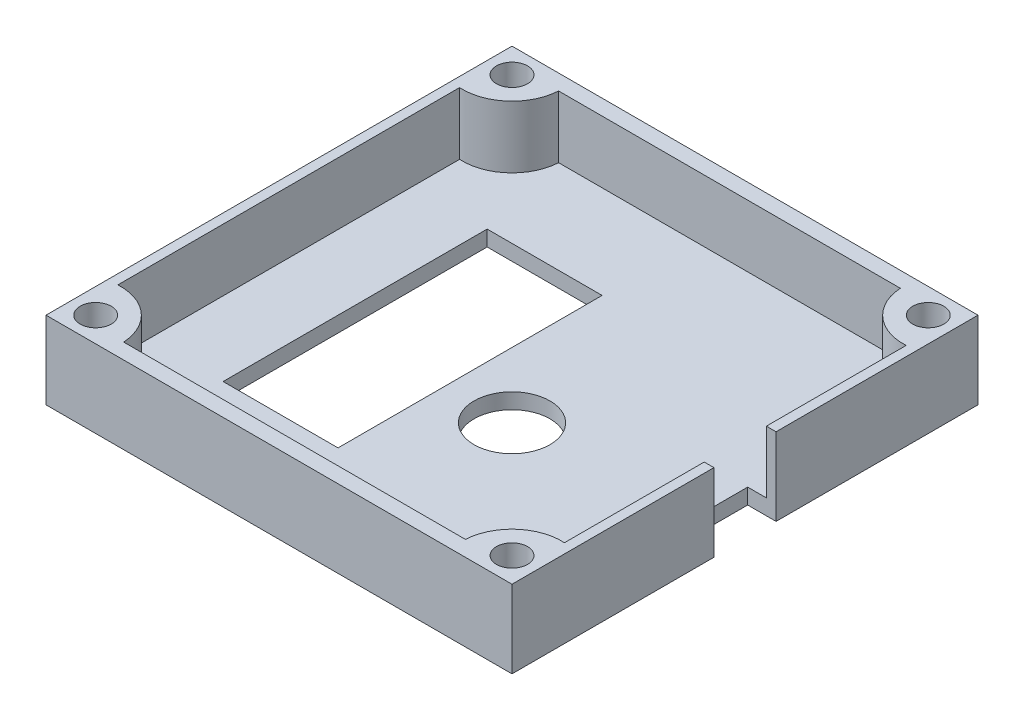
ISO-10303-21;
HEADER;
FILE_DESCRIPTION(('STEP AP214'),'2;1');
FILE_NAME('part.step','',(''),(''),'','','');
FILE_SCHEMA(('AUTOMOTIVE_DESIGN { 1 0 10303 214 1 1 1 1 }'));
ENDSEC;
DATA;
#1=APPLICATION_CONTEXT('core data for automotive mechanical design processes');
#2=APPLICATION_PROTOCOL_DEFINITION('international standard','automotive_design',2000,#1);
#3=PRODUCT_CONTEXT('',#1,'mechanical');
#4=PRODUCT('Part','Part','',(#3));
#5=PRODUCT_RELATED_PRODUCT_CATEGORY('part','',(#4));
#6=PRODUCT_DEFINITION_FORMATION('','',#4);
#7=PRODUCT_DEFINITION_CONTEXT('part definition',#1,'design');
#8=PRODUCT_DEFINITION('design','',#6,#7);
#9=PRODUCT_DEFINITION_SHAPE('','',#8);
#10=(LENGTH_UNIT() NAMED_UNIT(*) SI_UNIT(.MILLI.,.METRE.));
#11=(NAMED_UNIT(*) PLANE_ANGLE_UNIT() SI_UNIT($,.RADIAN.));
#12=(NAMED_UNIT(*) SI_UNIT($,.STERADIAN.) SOLID_ANGLE_UNIT());
#13=UNCERTAINTY_MEASURE_WITH_UNIT(LENGTH_MEASURE(1.E-05),#10,'distance_accuracy_value','');
#14=(GEOMETRIC_REPRESENTATION_CONTEXT(3) GLOBAL_UNCERTAINTY_ASSIGNED_CONTEXT((#13)) GLOBAL_UNIT_ASSIGNED_CONTEXT((#10,
#11,#12)) REPRESENTATION_CONTEXT('',''));
#15=CARTESIAN_POINT('',(0.,0.,0.));
#16=DIRECTION('',(0.,0.,1.));
#17=DIRECTION('',(1.,0.,0.));
#18=AXIS2_PLACEMENT_3D('',#15,#16,#17);
#19=CARTESIAN_POINT('',(0.,6.35,0.));
#20=DIRECTION('',(0.,1.,0.));
#21=DIRECTION('',(0.,0.,1.));
#22=AXIS2_PLACEMENT_3D('',#19,#20,#21);
#23=PLANE('',#22);
#24=CARTESIAN_POINT('',(17.018,6.35,17.018));
#25=DIRECTION('',(0.,1.,0.));
#26=DIRECTION('',(0.,0.,1.));
#27=AXIS2_PLACEMENT_3D('',#24,#25,#26);
#28=CIRCLE('',#27,1.27);
#29=CARTESIAN_POINT('',(17.018,6.35,18.288));
#30=VERTEX_POINT('',#29);
#31=EDGE_CURVE('E321',#30,#30,#28,.T.);
#32=ORIENTED_EDGE('',*,*,#31,.F.);
#33=EDGE_LOOP('',(#32));
#34=FACE_BOUND('',#33,.T.);
#35=CARTESIAN_POINT('',(-17.018,6.35,-17.018));
#36=DIRECTION('',(0.,1.,0.));
#37=DIRECTION('',(0.,0.,1.));
#38=AXIS2_PLACEMENT_3D('',#35,#36,#37);
#39=CIRCLE('',#38,1.27);
#40=CARTESIAN_POINT('',(-17.018,6.35,-15.748));
#41=VERTEX_POINT('',#40);
#42=EDGE_CURVE('E333',#41,#41,#39,.T.);
#43=ORIENTED_EDGE('',*,*,#42,.F.);
#44=EDGE_LOOP('',(#43));
#45=FACE_BOUND('',#44,.T.);
#46=CARTESIAN_POINT('',(-17.018,6.35,17.018));
#47=DIRECTION('',(0.,1.,0.));
#48=DIRECTION('',(0.,0.,-1.));
#49=AXIS2_PLACEMENT_3D('',#46,#47,#48);
#50=CIRCLE('',#49,1.27);
#51=CARTESIAN_POINT('',(-17.018,6.35,15.748));
#52=VERTEX_POINT('',#51);
#53=EDGE_CURVE('E327',#52,#52,#50,.T.);
#54=ORIENTED_EDGE('',*,*,#53,.F.);
#55=EDGE_LOOP('',(#54));
#56=FACE_BOUND('',#55,.T.);
#57=CARTESIAN_POINT('',(17.018,6.35,-17.018));
#58=DIRECTION('',(0.,1.,0.));
#59=DIRECTION('',(0.,0.,-1.));
#60=AXIS2_PLACEMENT_3D('',#57,#58,#59);
#61=CIRCLE('',#60,1.27);
#62=CARTESIAN_POINT('',(17.018,6.35,-18.288));
#63=VERTEX_POINT('',#62);
#64=EDGE_CURVE('E315',#63,#63,#61,.T.);
#65=ORIENTED_EDGE('',*,*,#64,.F.);
#66=EDGE_LOOP('',(#65));
#67=FACE_BOUND('',#66,.T.);
#68=DIRECTION('',(0.,0.,1.));
#69=VECTOR('',#68,1.);
#70=CARTESIAN_POINT('',(18.2562620388484,6.35,0.));
#71=LINE('',#70,#69);
#72=CARTESIAN_POINT('',(18.2562620388484,6.35,-13.97));
#73=VERTEX_POINT('',#72);
#74=CARTESIAN_POINT('',(18.2562620388484,6.35,-2.54000000000001));
#75=VERTEX_POINT('',#74);
#76=EDGE_CURVE('E273',#73,#75,#71,.T.);
#77=ORIENTED_EDGE('',*,*,#76,.T.);
#78=DIRECTION('',(-1.,0.,0.));
#79=VECTOR('',#78,1.);
#80=CARTESIAN_POINT('',(0.,6.35,-2.54000000000001));
#81=LINE('',#80,#79);
#82=CARTESIAN_POINT('',(19.05,6.35,-2.54000000000001));
#83=VERTEX_POINT('',#82);
#84=EDGE_CURVE('E191',#83,#75,#81,.T.);
#85=ORIENTED_EDGE('',*,*,#84,.F.);
#86=DIRECTION('',(0.,0.,-1.));
#87=VECTOR('',#86,1.);
#88=CARTESIAN_POINT('',(19.05,6.35,19.05));
#89=LINE('',#88,#87);
#90=CARTESIAN_POINT('',(19.05,6.35,-19.05));
#91=VERTEX_POINT('',#90);
#92=EDGE_CURVE('E345',#83,#91,#89,.T.);
#93=ORIENTED_EDGE('',*,*,#92,.T.);
#94=DIRECTION('',(-1.,0.,0.));
#95=VECTOR('',#94,1.);
#96=CARTESIAN_POINT('',(19.05,6.35,-19.05));
#97=LINE('',#96,#95);
#98=CARTESIAN_POINT('',(-19.05,6.35,-19.05));
#99=VERTEX_POINT('',#98);
#100=EDGE_CURVE('E349',#91,#99,#97,.T.);
#101=ORIENTED_EDGE('',*,*,#100,.T.);
#102=DIRECTION('',(0.,0.,1.));
#103=VECTOR('',#102,1.);
#104=CARTESIAN_POINT('',(-19.05,6.35,19.05));
#105=LINE('',#104,#103);
#106=CARTESIAN_POINT('',(-19.05,6.35,19.05));
#107=VERTEX_POINT('',#106);
#108=EDGE_CURVE('E339',#99,#107,#105,.T.);
#109=ORIENTED_EDGE('',*,*,#108,.T.);
#110=DIRECTION('',(1.,0.,0.));
#111=VECTOR('',#110,1.);
#112=CARTESIAN_POINT('',(19.05,6.35,19.05));
#113=LINE('',#112,#111);
#114=CARTESIAN_POINT('',(19.05,6.35,19.05));
#115=VERTEX_POINT('',#114);
#116=EDGE_CURVE('E342',#107,#115,#113,.T.);
#117=ORIENTED_EDGE('',*,*,#116,.T.);
#118=CARTESIAN_POINT('',(19.05,6.35,2.54000000000001));
#119=VERTEX_POINT('',#118);
#120=EDGE_CURVE('E346',#115,#119,#89,.T.);
#121=ORIENTED_EDGE('',*,*,#120,.T.);
#122=DIRECTION('',(-1.,0.,0.));
#123=VECTOR('',#122,1.);
#124=CARTESIAN_POINT('',(0.,6.35,2.54000000000001));
#125=LINE('',#124,#123);
#126=CARTESIAN_POINT('',(18.2562620388484,6.35,2.54000000000001));
#127=VERTEX_POINT('',#126);
#128=EDGE_CURVE('E206',#119,#127,#125,.T.);
#129=ORIENTED_EDGE('',*,*,#128,.T.);
#130=CARTESIAN_POINT('',(18.2562620388484,6.35,13.97));
#131=VERTEX_POINT('',#130);
#132=EDGE_CURVE('E249',#127,#131,#71,.T.);
#133=ORIENTED_EDGE('',*,*,#132,.T.);
#134=CARTESIAN_POINT('',(18.0181310194242,6.35,18.0181310194242));
#135=DIRECTION('',(0.,1.,0.));
#136=DIRECTION('',(0.,0.,1.));
#137=AXIS2_PLACEMENT_3D('',#134,#135,#136);
#138=CIRCLE('',#137,4.05512899089987);
#139=CARTESIAN_POINT('',(13.97,6.35,17.78));
#140=VERTEX_POINT('',#139);
#141=EDGE_CURVE('E294',#131,#140,#138,.T.);
#142=ORIENTED_EDGE('',*,*,#141,.T.);
#143=DIRECTION('',(1.,0.,0.));
#144=VECTOR('',#143,1.);
#145=CARTESIAN_POINT('',(0.,6.35,17.78));
#146=LINE('',#145,#144);
#147=CARTESIAN_POINT('',(-13.97,6.35,17.78));
#148=VERTEX_POINT('',#147);
#149=EDGE_CURVE('E291',#148,#140,#146,.T.);
#150=ORIENTED_EDGE('',*,*,#149,.F.);
#151=CARTESIAN_POINT('',(-18.0181310194242,6.35,18.0181310194242));
#152=DIRECTION('',(0.,1.,0.));
#153=DIRECTION('',(0.,0.,1.));
#154=AXIS2_PLACEMENT_3D('',#151,#152,#153);
#155=CIRCLE('',#154,4.05512899089987);
#156=CARTESIAN_POINT('',(-18.2562620388484,6.35,13.97));
#157=VERTEX_POINT('',#156);
#158=EDGE_CURVE('E288',#157,#148,#155,.F.);
#159=ORIENTED_EDGE('',*,*,#158,.F.);
#160=DIRECTION('',(0.,0.,1.));
#161=VECTOR('',#160,1.);
#162=CARTESIAN_POINT('',(-18.2562620388484,6.35,0.));
#163=LINE('',#162,#161);
#164=CARTESIAN_POINT('',(-18.2562620388484,6.35,-13.97));
#165=VERTEX_POINT('',#164);
#166=EDGE_CURVE('E285',#165,#157,#163,.T.);
#167=ORIENTED_EDGE('',*,*,#166,.F.);
#168=CARTESIAN_POINT('',(-18.0181310194242,6.35,-18.0181310194242));
#169=DIRECTION('',(0.,1.,0.));
#170=DIRECTION('',(0.,0.,1.));
#171=AXIS2_PLACEMENT_3D('',#168,#169,#170);
#172=CIRCLE('',#171,4.05512899089987);
#173=CARTESIAN_POINT('',(-13.97,6.35,-17.78));
#174=VERTEX_POINT('',#173);
#175=EDGE_CURVE('E282',#165,#174,#172,.T.);
#176=ORIENTED_EDGE('',*,*,#175,.T.);
#177=DIRECTION('',(1.,0.,0.));
#178=VECTOR('',#177,1.);
#179=CARTESIAN_POINT('',(0.,6.35,-17.78));
#180=LINE('',#179,#178);
#181=CARTESIAN_POINT('',(13.97,6.35,-17.78));
#182=VERTEX_POINT('',#181);
#183=EDGE_CURVE('E279',#174,#182,#180,.T.);
#184=ORIENTED_EDGE('',*,*,#183,.T.);
#185=CARTESIAN_POINT('',(18.0181310194242,6.35,-18.0181310194242));
#186=DIRECTION('',(0.,1.,0.));
#187=DIRECTION('',(0.,0.,1.));
#188=AXIS2_PLACEMENT_3D('',#185,#186,#187);
#189=CIRCLE('',#188,4.05512899089987);
#190=EDGE_CURVE('E276',#73,#182,#189,.F.);
#191=ORIENTED_EDGE('',*,*,#190,.F.);
#192=EDGE_LOOP('',(#77,#85,#93,#101,#109,#117,#121,#129,#133,#142,#150,#159,#167,#176,#184,#191));
#193=FACE_BOUND('',#192,.T.);
#194=ADVANCED_FACE('F33',(#34,#45,#56,#67,#193),#23,.T.);
#195=CARTESIAN_POINT('',(0.,0.,0.));
#196=DIRECTION('',(0.,1.,0.));
#197=DIRECTION('',(0.,0.,1.));
#198=AXIS2_PLACEMENT_3D('',#195,#196,#197);
#199=PLANE('',#198);
#200=CARTESIAN_POINT('',(2.54,0.,2.54000000000001));
#201=DIRECTION('',(0.,-1.,0.));
#202=DIRECTION('',(0.,0.,-1.));
#203=AXIS2_PLACEMENT_3D('',#200,#201,#202);
#204=CIRCLE('',#203,3.1018943278166);
#205=CARTESIAN_POINT('',(2.54,0.,-0.561894327816595));
#206=VERTEX_POINT('',#205);
#207=EDGE_CURVE('E525',#206,#206,#204,.T.);
#208=ORIENTED_EDGE('',*,*,#207,.F.);
#209=EDGE_LOOP('',(#208));
#210=FACE_BOUND('',#209,.T.);
#211=CARTESIAN_POINT('',(17.018,0.,-17.018));
#212=DIRECTION('',(0.,1.,0.));
#213=DIRECTION('',(0.,0.,-1.));
#214=AXIS2_PLACEMENT_3D('',#211,#212,#213);
#215=CIRCLE('',#214,1.27);
#216=CARTESIAN_POINT('',(17.018,0.,-18.288));
#217=VERTEX_POINT('',#216);
#218=EDGE_CURVE('E300',#217,#217,#215,.T.);
#219=ORIENTED_EDGE('',*,*,#218,.T.);
#220=EDGE_LOOP('',(#219));
#221=FACE_BOUND('',#220,.T.);
#222=CARTESIAN_POINT('',(17.018,0.,17.018));
#223=DIRECTION('',(0.,1.,0.));
#224=DIRECTION('',(0.,0.,1.));
#225=AXIS2_PLACEMENT_3D('',#222,#223,#224);
#226=CIRCLE('',#225,1.27);
#227=CARTESIAN_POINT('',(17.018,0.,18.288));
#228=VERTEX_POINT('',#227);
#229=EDGE_CURVE('E318',#228,#228,#226,.T.);
#230=ORIENTED_EDGE('',*,*,#229,.T.);
#231=EDGE_LOOP('',(#230));
#232=FACE_BOUND('',#231,.T.);
#233=CARTESIAN_POINT('',(-17.018,0.,17.018));
#234=DIRECTION('',(0.,1.,0.));
#235=DIRECTION('',(0.,0.,-1.));
#236=AXIS2_PLACEMENT_3D('',#233,#234,#235);
#237=CIRCLE('',#236,1.27);
#238=CARTESIAN_POINT('',(-17.018,0.,15.748));
#239=VERTEX_POINT('',#238);
#240=EDGE_CURVE('E324',#239,#239,#237,.T.);
#241=ORIENTED_EDGE('',*,*,#240,.T.);
#242=EDGE_LOOP('',(#241));
#243=FACE_BOUND('',#242,.T.);
#244=CARTESIAN_POINT('',(-17.018,0.,-17.018));
#245=DIRECTION('',(0.,1.,0.));
#246=DIRECTION('',(0.,0.,1.));
#247=AXIS2_PLACEMENT_3D('',#244,#245,#246);
#248=CIRCLE('',#247,1.27);
#249=CARTESIAN_POINT('',(-17.018,0.,-15.748));
#250=VERTEX_POINT('',#249);
#251=EDGE_CURVE('E330',#250,#250,#248,.T.);
#252=ORIENTED_EDGE('',*,*,#251,.T.);
#253=EDGE_LOOP('',(#252));
#254=FACE_BOUND('',#253,.T.);
#255=DIRECTION('',(1.,0.,0.));
#256=VECTOR('',#255,1.);
#257=CARTESIAN_POINT('',(-2.794,0.,-10.16));
#258=LINE('',#257,#256);
#259=CARTESIAN_POINT('',(-12.192,0.,-10.16));
#260=VERTEX_POINT('',#259);
#261=CARTESIAN_POINT('',(-2.794,0.,-10.16));
#262=VERTEX_POINT('',#261);
#263=EDGE_CURVE('E229',#260,#262,#258,.T.);
#264=ORIENTED_EDGE('',*,*,#263,.F.);
#265=DIRECTION('',(0.,0.,-1.));
#266=VECTOR('',#265,1.);
#267=CARTESIAN_POINT('',(-12.192,0.,-10.16));
#268=LINE('',#267,#266);
#269=CARTESIAN_POINT('',(-12.192,0.,11.43));
#270=VERTEX_POINT('',#269);
#271=EDGE_CURVE('E57',#270,#260,#268,.T.);
#272=ORIENTED_EDGE('',*,*,#271,.F.);
#273=DIRECTION('',(-1.,0.,0.));
#274=VECTOR('',#273,1.);
#275=CARTESIAN_POINT('',(-2.794,0.,11.43));
#276=LINE('',#275,#274);
#277=CARTESIAN_POINT('',(-2.794,0.,11.43));
#278=VERTEX_POINT('',#277);
#279=EDGE_CURVE('E235',#278,#270,#276,.T.);
#280=ORIENTED_EDGE('',*,*,#279,.F.);
#281=DIRECTION('',(0.,0.,1.));
#282=VECTOR('',#281,1.);
#283=CARTESIAN_POINT('',(-2.794,0.,-10.16));
#284=LINE('',#283,#282);
#285=EDGE_CURVE('E232',#262,#278,#284,.T.);
#286=ORIENTED_EDGE('',*,*,#285,.F.);
#287=EDGE_LOOP('',(#264,#272,#280,#286));
#288=FACE_BOUND('',#287,.T.);
#289=DIRECTION('',(-1.,0.,0.));
#290=VECTOR('',#289,1.);
#291=CARTESIAN_POINT('',(0.,0.,-2.54000000000001));
#292=LINE('',#291,#290);
#293=CARTESIAN_POINT('',(19.05,0.,-2.54000000000001));
#294=VERTEX_POINT('',#293);
#295=CARTESIAN_POINT('',(16.7295982245568,0.,-2.54000000000001));
#296=VERTEX_POINT('',#295);
#297=EDGE_CURVE('E204',#294,#296,#292,.T.);
#298=ORIENTED_EDGE('',*,*,#297,.T.);
#299=DIRECTION('',(0.,0.,1.));
#300=VECTOR('',#299,1.);
#301=CARTESIAN_POINT('',(16.7295982245568,0.,0.));
#302=LINE('',#301,#300);
#303=CARTESIAN_POINT('',(16.7295982245568,0.,2.54000000000001));
#304=VERTEX_POINT('',#303);
#305=EDGE_CURVE('E186',#296,#304,#302,.T.);
#306=ORIENTED_EDGE('',*,*,#305,.T.);
#307=DIRECTION('',(-1.,0.,0.));
#308=VECTOR('',#307,1.);
#309=CARTESIAN_POINT('',(0.,0.,2.54000000000001));
#310=LINE('',#309,#308);
#311=CARTESIAN_POINT('',(19.05,0.,2.54000000000001));
#312=VERTEX_POINT('',#311);
#313=EDGE_CURVE('E194',#312,#304,#310,.T.);
#314=ORIENTED_EDGE('',*,*,#313,.F.);
#315=DIRECTION('',(0.,0.,-1.));
#316=VECTOR('',#315,1.);
#317=CARTESIAN_POINT('',(19.05,0.,19.05));
#318=LINE('',#317,#316);
#319=CARTESIAN_POINT('',(19.05,0.,19.05));
#320=VERTEX_POINT('',#319);
#321=EDGE_CURVE('E357',#320,#312,#318,.T.);
#322=ORIENTED_EDGE('',*,*,#321,.F.);
#323=DIRECTION('',(1.,0.,0.));
#324=VECTOR('',#323,1.);
#325=CARTESIAN_POINT('',(19.05,0.,19.05));
#326=LINE('',#325,#324);
#327=CARTESIAN_POINT('',(-19.05,0.,19.05));
#328=VERTEX_POINT('',#327);
#329=EDGE_CURVE('E354',#328,#320,#326,.T.);
#330=ORIENTED_EDGE('',*,*,#329,.F.);
#331=DIRECTION('',(0.,0.,1.));
#332=VECTOR('',#331,1.);
#333=CARTESIAN_POINT('',(-19.05,0.,19.05));
#334=LINE('',#333,#332);
#335=CARTESIAN_POINT('',(-19.05,0.,-19.05));
#336=VERTEX_POINT('',#335);
#337=EDGE_CURVE('E336',#336,#328,#334,.T.);
#338=ORIENTED_EDGE('',*,*,#337,.F.);
#339=DIRECTION('',(-1.,0.,0.));
#340=VECTOR('',#339,1.);
#341=CARTESIAN_POINT('',(19.05,0.,-19.05));
#342=LINE('',#341,#340);
#343=CARTESIAN_POINT('',(19.05,0.,-19.05));
#344=VERTEX_POINT('',#343);
#345=EDGE_CURVE('E343',#344,#336,#342,.T.);
#346=ORIENTED_EDGE('',*,*,#345,.F.);
#347=EDGE_CURVE('E356',#294,#344,#318,.T.);
#348=ORIENTED_EDGE('',*,*,#347,.F.);
#349=EDGE_LOOP('',(#298,#306,#314,#322,#330,#338,#346,#348));
#350=FACE_BOUND('',#349,.T.);
#351=ADVANCED_FACE('F202',(#210,#221,#232,#243,#254,#288,#350),#199,.F.);
#352=CARTESIAN_POINT('',(19.05,6.35,19.05));
#353=DIRECTION('',(-1.,0.,0.));
#354=DIRECTION('',(0.,0.,1.));
#355=AXIS2_PLACEMENT_3D('',#352,#353,#354);
#356=PLANE('',#355);
#357=DIRECTION('',(0.,1.,0.));
#358=VECTOR('',#357,1.);
#359=CARTESIAN_POINT('',(19.05,6.35,-2.54000000000001));
#360=LINE('',#359,#358);
#361=EDGE_CURVE('E217',#294,#83,#360,.T.);
#362=ORIENTED_EDGE('',*,*,#361,.F.);
#363=ORIENTED_EDGE('',*,*,#347,.T.);
#364=DIRECTION('',(0.,-1.,0.));
#365=VECTOR('',#364,1.);
#366=CARTESIAN_POINT('',(19.05,6.35,-19.05));
#367=LINE('',#366,#365);
#368=EDGE_CURVE('E362',#91,#344,#367,.T.);
#369=ORIENTED_EDGE('',*,*,#368,.F.);
#370=ORIENTED_EDGE('',*,*,#92,.F.);
#371=EDGE_LOOP('',(#362,#363,#369,#370));
#372=FACE_BOUND('',#371,.T.);
#373=ADVANCED_FACE('F423',(#372),#356,.F.);
#374=CARTESIAN_POINT('',(18.2562620388484,1.27,0.));
#375=DIRECTION('',(-1.,0.,0.));
#376=DIRECTION('',(0.,0.,1.));
#377=AXIS2_PLACEMENT_3D('',#374,#375,#376);
#378=PLANE('',#377);
#379=DIRECTION('',(0.,0.,1.));
#380=VECTOR('',#379,1.);
#381=CARTESIAN_POINT('',(18.2562620388484,1.27,0.));
#382=LINE('',#381,#380);
#383=CARTESIAN_POINT('',(18.2562620388484,1.27,-13.97));
#384=VERTEX_POINT('',#383);
#385=CARTESIAN_POINT('',(18.2562620388484,1.27,-2.54000000000001));
#386=VERTEX_POINT('',#385);
#387=EDGE_CURVE('E250',#384,#386,#382,.T.);
#388=ORIENTED_EDGE('',*,*,#387,.T.);
#389=DIRECTION('',(0.,1.,0.));
#390=VECTOR('',#389,1.);
#391=CARTESIAN_POINT('',(18.2562620388484,1.27,-2.54000000000001));
#392=LINE('',#391,#390);
#393=EDGE_CURVE('E214',#386,#75,#392,.T.);
#394=ORIENTED_EDGE('',*,*,#393,.T.);
#395=ORIENTED_EDGE('',*,*,#76,.F.);
#396=DIRECTION('',(0.,1.,0.));
#397=VECTOR('',#396,1.);
#398=CARTESIAN_POINT('',(18.2562620388484,1.27,-13.97));
#399=LINE('',#398,#397);
#400=EDGE_CURVE('E272',#384,#73,#399,.T.);
#401=ORIENTED_EDGE('',*,*,#400,.F.);
#402=EDGE_LOOP('',(#388,#394,#395,#401));
#403=FACE_BOUND('',#402,.T.);
#404=ADVANCED_FACE('F416',(#403),#378,.T.);
#405=CARTESIAN_POINT('',(0.,1.27,0.));
#406=DIRECTION('',(0.,1.,0.));
#407=DIRECTION('',(0.,0.,1.));
#408=AXIS2_PLACEMENT_3D('',#405,#406,#407);
#409=PLANE('',#408);
#410=CARTESIAN_POINT('',(2.54,1.27,2.54000000000001));
#411=DIRECTION('',(0.,1.,0.));
#412=DIRECTION('',(0.,0.,1.));
#413=AXIS2_PLACEMENT_3D('',#410,#411,#412);
#414=CIRCLE('',#413,3.1018943278166);
#415=CARTESIAN_POINT('',(2.54,1.27,5.64189432781661));
#416=VERTEX_POINT('',#415);
#417=EDGE_CURVE('E37',#416,#416,#414,.T.);
#418=ORIENTED_EDGE('',*,*,#417,.F.);
#419=EDGE_LOOP('',(#418));
#420=FACE_BOUND('',#419,.T.);
#421=DIRECTION('',(0.,0.,-1.));
#422=VECTOR('',#421,1.);
#423=CARTESIAN_POINT('',(-12.192,1.27,-10.16));
#424=LINE('',#423,#422);
#425=CARTESIAN_POINT('',(-12.192,1.27,11.43));
#426=VERTEX_POINT('',#425);
#427=CARTESIAN_POINT('',(-12.192,1.27,-10.16));
#428=VERTEX_POINT('',#427);
#429=EDGE_CURVE('E225',#426,#428,#424,.T.);
#430=ORIENTED_EDGE('',*,*,#429,.T.);
#431=DIRECTION('',(1.,0.,0.));
#432=VECTOR('',#431,1.);
#433=CARTESIAN_POINT('',(-2.794,1.27,-10.16));
#434=LINE('',#433,#432);
#435=CARTESIAN_POINT('',(-2.794,1.27,-10.16));
#436=VERTEX_POINT('',#435);
#437=EDGE_CURVE('E241',#428,#436,#434,.T.);
#438=ORIENTED_EDGE('',*,*,#437,.T.);
#439=DIRECTION('',(0.,0.,1.));
#440=VECTOR('',#439,1.);
#441=CARTESIAN_POINT('',(-2.794,1.27,-10.16));
#442=LINE('',#441,#440);
#443=CARTESIAN_POINT('',(-2.794,1.27,11.43));
#444=VERTEX_POINT('',#443);
#445=EDGE_CURVE('E219',#436,#444,#442,.T.);
#446=ORIENTED_EDGE('',*,*,#445,.T.);
#447=DIRECTION('',(-1.,0.,0.));
#448=VECTOR('',#447,1.);
#449=CARTESIAN_POINT('',(-2.794,1.27,11.43));
#450=LINE('',#449,#448);
#451=EDGE_CURVE('E222',#444,#426,#450,.T.);
#452=ORIENTED_EDGE('',*,*,#451,.T.);
#453=EDGE_LOOP('',(#430,#438,#446,#452));
#454=FACE_BOUND('',#453,.T.);
#455=DIRECTION('',(0.,0.,-1.));
#456=VECTOR('',#455,1.);
#457=CARTESIAN_POINT('',(16.7295982245568,1.27,0.));
#458=LINE('',#457,#456);
#459=CARTESIAN_POINT('',(16.7295982245568,1.27,2.54000000000001));
#460=VERTEX_POINT('',#459);
#461=CARTESIAN_POINT('',(16.7295982245568,1.27,-2.54000000000001));
#462=VERTEX_POINT('',#461);
#463=EDGE_CURVE('E42',#460,#462,#458,.T.);
#464=ORIENTED_EDGE('',*,*,#463,.T.);
#465=DIRECTION('',(1.,0.,0.));
#466=VECTOR('',#465,1.);
#467=CARTESIAN_POINT('',(0.,1.27,-2.54000000000001));
#468=LINE('',#467,#466);
#469=EDGE_CURVE('E11',#462,#386,#468,.T.);
#470=ORIENTED_EDGE('',*,*,#469,.T.);
#471=ORIENTED_EDGE('',*,*,#387,.F.);
#472=CARTESIAN_POINT('',(18.0181310194242,1.27,-18.0181310194242));
#473=DIRECTION('',(0.,1.,0.));
#474=DIRECTION('',(0.,0.,1.));
#475=AXIS2_PLACEMENT_3D('',#472,#473,#474);
#476=CIRCLE('',#475,4.05512899089987);
#477=CARTESIAN_POINT('',(13.97,1.27,-17.78));
#478=VERTEX_POINT('',#477);
#479=EDGE_CURVE('E253',#384,#478,#476,.F.);
#480=ORIENTED_EDGE('',*,*,#479,.T.);
#481=DIRECTION('',(1.,0.,0.));
#482=VECTOR('',#481,1.);
#483=CARTESIAN_POINT('',(0.,1.27,-17.78));
#484=LINE('',#483,#482);
#485=CARTESIAN_POINT('',(-13.97,1.27,-17.78));
#486=VERTEX_POINT('',#485);
#487=EDGE_CURVE('E257',#486,#478,#484,.T.);
#488=ORIENTED_EDGE('',*,*,#487,.F.);
#489=CARTESIAN_POINT('',(-18.0181310194242,1.27,-18.0181310194242));
#490=DIRECTION('',(0.,1.,0.));
#491=DIRECTION('',(0.,0.,1.));
#492=AXIS2_PLACEMENT_3D('',#489,#490,#491);
#493=CIRCLE('',#492,4.05512899089987);
#494=CARTESIAN_POINT('',(-18.2562620388484,1.27,-13.97));
#495=VERTEX_POINT('',#494);
#496=EDGE_CURVE('E259',#495,#486,#493,.T.);
#497=ORIENTED_EDGE('',*,*,#496,.F.);
#498=DIRECTION('',(0.,0.,1.));
#499=VECTOR('',#498,1.);
#500=CARTESIAN_POINT('',(-18.2562620388484,1.27,0.));
#501=LINE('',#500,#499);
#502=CARTESIAN_POINT('',(-18.2562620388484,1.27,13.97));
#503=VERTEX_POINT('',#502);
#504=EDGE_CURVE('E261',#495,#503,#501,.T.);
#505=ORIENTED_EDGE('',*,*,#504,.T.);
#506=CARTESIAN_POINT('',(-18.0181310194242,1.27,18.0181310194242));
#507=DIRECTION('',(0.,1.,0.));
#508=DIRECTION('',(0.,0.,1.));
#509=AXIS2_PLACEMENT_3D('',#506,#507,#508);
#510=CIRCLE('',#509,4.05512899089987);
#511=CARTESIAN_POINT('',(-13.97,1.27,17.78));
#512=VERTEX_POINT('',#511);
#513=EDGE_CURVE('E264',#503,#512,#510,.F.);
#514=ORIENTED_EDGE('',*,*,#513,.T.);
#515=DIRECTION('',(1.,0.,0.));
#516=VECTOR('',#515,1.);
#517=CARTESIAN_POINT('',(0.,1.27,17.78));
#518=LINE('',#517,#516);
#519=CARTESIAN_POINT('',(13.97,1.27,17.78));
#520=VERTEX_POINT('',#519);
#521=EDGE_CURVE('E267',#512,#520,#518,.T.);
#522=ORIENTED_EDGE('',*,*,#521,.T.);
#523=CARTESIAN_POINT('',(18.0181310194242,1.27,18.0181310194242));
#524=DIRECTION('',(0.,1.,0.));
#525=DIRECTION('',(0.,0.,1.));
#526=AXIS2_PLACEMENT_3D('',#523,#524,#525);
#527=CIRCLE('',#526,4.05512899089987);
#528=CARTESIAN_POINT('',(18.2562620388484,1.27,13.97));
#529=VERTEX_POINT('',#528);
#530=EDGE_CURVE('E270',#529,#520,#527,.T.);
#531=ORIENTED_EDGE('',*,*,#530,.F.);
#532=CARTESIAN_POINT('',(18.2562620388484,1.27,2.54000000000001));
#533=VERTEX_POINT('',#532);
#534=EDGE_CURVE('E254',#533,#529,#382,.T.);
#535=ORIENTED_EDGE('',*,*,#534,.F.);
#536=DIRECTION('',(1.,0.,0.));
#537=VECTOR('',#536,1.);
#538=CARTESIAN_POINT('',(0.,1.27,2.54000000000001));
#539=LINE('',#538,#537);
#540=EDGE_CURVE('E371',#460,#533,#539,.T.);
#541=ORIENTED_EDGE('',*,*,#540,.F.);
#542=EDGE_LOOP('',(#464,#470,#471,#480,#488,#497,#505,#514,#522,#531,#535,#541));
#543=FACE_BOUND('',#542,.T.);
#544=ADVANCED_FACE('F374',(#420,#454,#543),#409,.T.);
#545=CARTESIAN_POINT('',(-19.05,6.35,19.05));
#546=DIRECTION('',(1.,0.,0.));
#547=DIRECTION('',(0.,0.,-1.));
#548=AXIS2_PLACEMENT_3D('',#545,#546,#547);
#549=PLANE('',#548);
#550=ORIENTED_EDGE('',*,*,#337,.T.);
#551=DIRECTION('',(0.,-1.,0.));
#552=VECTOR('',#551,1.);
#553=CARTESIAN_POINT('',(-19.05,6.35,19.05));
#554=LINE('',#553,#552);
#555=EDGE_CURVE('E368',#107,#328,#554,.T.);
#556=ORIENTED_EDGE('',*,*,#555,.F.);
#557=ORIENTED_EDGE('',*,*,#108,.F.);
#558=DIRECTION('',(0.,-1.,0.));
#559=VECTOR('',#558,1.);
#560=CARTESIAN_POINT('',(-19.05,6.35,-19.05));
#561=LINE('',#560,#559);
#562=EDGE_CURVE('E351',#99,#336,#561,.T.);
#563=ORIENTED_EDGE('',*,*,#562,.T.);
#564=EDGE_LOOP('',(#550,#556,#557,#563));
#565=FACE_BOUND('',#564,.T.);
#566=ADVANCED_FACE('F35',(#565),#549,.F.);
#567=CARTESIAN_POINT('',(19.05,6.35,19.05));
#568=DIRECTION('',(0.,0.,-1.));
#569=DIRECTION('',(-1.,0.,0.));
#570=AXIS2_PLACEMENT_3D('',#567,#568,#569);
#571=PLANE('',#570);
#572=ORIENTED_EDGE('',*,*,#329,.T.);
#573=DIRECTION('',(0.,-1.,0.));
#574=VECTOR('',#573,1.);
#575=CARTESIAN_POINT('',(19.05,6.35,19.05));
#576=LINE('',#575,#574);
#577=EDGE_CURVE('E365',#115,#320,#576,.T.);
#578=ORIENTED_EDGE('',*,*,#577,.F.);
#579=ORIENTED_EDGE('',*,*,#116,.F.);
#580=ORIENTED_EDGE('',*,*,#555,.T.);
#581=EDGE_LOOP('',(#572,#578,#579,#580));
#582=FACE_BOUND('',#581,.T.);
#583=ADVANCED_FACE('F435',(#582),#571,.F.);
#584=ORIENTED_EDGE('',*,*,#321,.T.);
#585=DIRECTION('',(0.,1.,0.));
#586=VECTOR('',#585,1.);
#587=CARTESIAN_POINT('',(19.05,6.35,2.54000000000001));
#588=LINE('',#587,#586);
#589=EDGE_CURVE('E197',#312,#119,#588,.T.);
#590=ORIENTED_EDGE('',*,*,#589,.T.);
#591=ORIENTED_EDGE('',*,*,#120,.F.);
#592=ORIENTED_EDGE('',*,*,#577,.T.);
#593=EDGE_LOOP('',(#584,#590,#591,#592));
#594=FACE_BOUND('',#593,.T.);
#595=ADVANCED_FACE('F438',(#594),#356,.F.);
#596=CARTESIAN_POINT('',(19.05,6.35,-19.05));
#597=DIRECTION('',(0.,0.,1.));
#598=DIRECTION('',(1.,0.,0.));
#599=AXIS2_PLACEMENT_3D('',#596,#597,#598);
#600=PLANE('',#599);
#601=ORIENTED_EDGE('',*,*,#345,.T.);
#602=ORIENTED_EDGE('',*,*,#562,.F.);
#603=ORIENTED_EDGE('',*,*,#100,.F.);
#604=ORIENTED_EDGE('',*,*,#368,.T.);
#605=EDGE_LOOP('',(#601,#602,#603,#604));
#606=FACE_BOUND('',#605,.T.);
#607=ADVANCED_FACE('F428',(#606),#600,.F.);
#608=CARTESIAN_POINT('',(-17.018,6.35,-17.018));
#609=DIRECTION('',(0.,-1.,0.));
#610=DIRECTION('',(0.,0.,-1.));
#611=AXIS2_PLACEMENT_3D('',#608,#609,#610);
#612=CYLINDRICAL_SURFACE('',#611,1.27);
#613=ORIENTED_EDGE('',*,*,#42,.T.);
#614=EDGE_LOOP('',(#613));
#615=FACE_BOUND('',#614,.T.);
#616=ORIENTED_EDGE('',*,*,#251,.F.);
#617=EDGE_LOOP('',(#616));
#618=FACE_BOUND('',#617,.T.);
#619=ADVANCED_FACE('F445',(#615,#618),#612,.F.);
#620=CARTESIAN_POINT('',(-17.018,6.35,17.018));
#621=DIRECTION('',(0.,-1.,0.));
#622=DIRECTION('',(0.,0.,-1.));
#623=AXIS2_PLACEMENT_3D('',#620,#621,#622);
#624=CYLINDRICAL_SURFACE('',#623,1.27);
#625=ORIENTED_EDGE('',*,*,#53,.T.);
#626=EDGE_LOOP('',(#625));
#627=FACE_BOUND('',#626,.T.);
#628=ORIENTED_EDGE('',*,*,#240,.F.);
#629=EDGE_LOOP('',(#628));
#630=FACE_BOUND('',#629,.T.);
#631=ADVANCED_FACE('F461',(#627,#630),#624,.F.);
#632=CARTESIAN_POINT('',(17.018,6.35,17.018));
#633=DIRECTION('',(0.,-1.,0.));
#634=DIRECTION('',(0.,0.,-1.));
#635=AXIS2_PLACEMENT_3D('',#632,#633,#634);
#636=CYLINDRICAL_SURFACE('',#635,1.27);
#637=ORIENTED_EDGE('',*,*,#31,.T.);
#638=EDGE_LOOP('',(#637));
#639=FACE_BOUND('',#638,.T.);
#640=ORIENTED_EDGE('',*,*,#229,.F.);
#641=EDGE_LOOP('',(#640));
#642=FACE_BOUND('',#641,.T.);
#643=ADVANCED_FACE('F465',(#639,#642),#636,.F.);
#644=CARTESIAN_POINT('',(17.018,6.35,-17.018));
#645=DIRECTION('',(0.,-1.,0.));
#646=DIRECTION('',(0.,0.,-1.));
#647=AXIS2_PLACEMENT_3D('',#644,#645,#646);
#648=CYLINDRICAL_SURFACE('',#647,1.27);
#649=ORIENTED_EDGE('',*,*,#64,.T.);
#650=EDGE_LOOP('',(#649));
#651=FACE_BOUND('',#650,.T.);
#652=ORIENTED_EDGE('',*,*,#218,.F.);
#653=EDGE_LOOP('',(#652));
#654=FACE_BOUND('',#653,.T.);
#655=ADVANCED_FACE('F469',(#651,#654),#648,.F.);
#656=DIRECTION('',(0.,1.,0.));
#657=VECTOR('',#656,1.);
#658=CARTESIAN_POINT('',(18.2562620388484,1.27,2.54000000000001));
#659=LINE('',#658,#657);
#660=EDGE_CURVE('E210',#533,#127,#659,.T.);
#661=ORIENTED_EDGE('',*,*,#660,.F.);
#662=ORIENTED_EDGE('',*,*,#534,.T.);
#663=DIRECTION('',(0.,1.,0.));
#664=VECTOR('',#663,1.);
#665=CARTESIAN_POINT('',(18.2562620388484,1.27,13.97));
#666=LINE('',#665,#664);
#667=EDGE_CURVE('E297',#529,#131,#666,.T.);
#668=ORIENTED_EDGE('',*,*,#667,.T.);
#669=ORIENTED_EDGE('',*,*,#132,.F.);
#670=EDGE_LOOP('',(#661,#662,#668,#669));
#671=FACE_BOUND('',#670,.T.);
#672=ADVANCED_FACE('F382',(#671),#378,.T.);
#673=CARTESIAN_POINT('',(18.0181310194242,1.27,18.0181310194242));
#674=DIRECTION('',(0.,1.,0.));
#675=DIRECTION('',(0.,0.,1.));
#676=AXIS2_PLACEMENT_3D('',#673,#674,#675);
#677=CYLINDRICAL_SURFACE('',#676,4.05512899089987);
#678=ORIENTED_EDGE('',*,*,#141,.F.);
#679=ORIENTED_EDGE('',*,*,#667,.F.);
#680=ORIENTED_EDGE('',*,*,#530,.T.);
#681=DIRECTION('',(0.,1.,0.));
#682=VECTOR('',#681,1.);
#683=CARTESIAN_POINT('',(13.97,1.27,17.78));
#684=LINE('',#683,#682);
#685=EDGE_CURVE('E301',#520,#140,#684,.T.);
#686=ORIENTED_EDGE('',*,*,#685,.T.);
#687=EDGE_LOOP('',(#678,#679,#680,#686));
#688=FACE_BOUND('',#687,.T.);
#689=ADVANCED_FACE('F388',(#688),#677,.T.);
#690=CARTESIAN_POINT('',(0.,1.27,17.78));
#691=DIRECTION('',(0.,0.,1.));
#692=DIRECTION('',(1.,0.,0.));
#693=AXIS2_PLACEMENT_3D('',#690,#691,#692);
#694=PLANE('',#693);
#695=ORIENTED_EDGE('',*,*,#149,.T.);
#696=ORIENTED_EDGE('',*,*,#685,.F.);
#697=ORIENTED_EDGE('',*,*,#521,.F.);
#698=DIRECTION('',(0.,1.,0.));
#699=VECTOR('',#698,1.);
#700=CARTESIAN_POINT('',(-13.97,1.27,17.78));
#701=LINE('',#700,#699);
#702=EDGE_CURVE('E303',#512,#148,#701,.T.);
#703=ORIENTED_EDGE('',*,*,#702,.T.);
#704=EDGE_LOOP('',(#695,#696,#697,#703));
#705=FACE_BOUND('',#704,.T.);
#706=ADVANCED_FACE('F392',(#705),#694,.F.);
#707=CARTESIAN_POINT('',(-18.0181310194242,1.27,18.0181310194242));
#708=DIRECTION('',(0.,1.,0.));
#709=DIRECTION('',(0.,0.,1.));
#710=AXIS2_PLACEMENT_3D('',#707,#708,#709);
#711=CYLINDRICAL_SURFACE('',#710,4.05512899089987);
#712=ORIENTED_EDGE('',*,*,#158,.T.);
#713=ORIENTED_EDGE('',*,*,#702,.F.);
#714=ORIENTED_EDGE('',*,*,#513,.F.);
#715=DIRECTION('',(0.,1.,0.));
#716=VECTOR('',#715,1.);
#717=CARTESIAN_POINT('',(-18.2562620388484,1.27,13.97));
#718=LINE('',#717,#716);
#719=EDGE_CURVE('E305',#503,#157,#718,.T.);
#720=ORIENTED_EDGE('',*,*,#719,.T.);
#721=EDGE_LOOP('',(#712,#713,#714,#720));
#722=FACE_BOUND('',#721,.T.);
#723=ADVANCED_FACE('F396',(#722),#711,.T.);
#724=CARTESIAN_POINT('',(-18.2562620388484,1.27,0.));
#725=DIRECTION('',(-1.,0.,0.));
#726=DIRECTION('',(0.,0.,1.));
#727=AXIS2_PLACEMENT_3D('',#724,#725,#726);
#728=PLANE('',#727);
#729=ORIENTED_EDGE('',*,*,#166,.T.);
#730=ORIENTED_EDGE('',*,*,#719,.F.);
#731=ORIENTED_EDGE('',*,*,#504,.F.);
#732=DIRECTION('',(0.,1.,0.));
#733=VECTOR('',#732,1.);
#734=CARTESIAN_POINT('',(-18.2562620388484,1.27,-13.97));
#735=LINE('',#734,#733);
#736=EDGE_CURVE('E307',#495,#165,#735,.T.);
#737=ORIENTED_EDGE('',*,*,#736,.T.);
#738=EDGE_LOOP('',(#729,#730,#731,#737));
#739=FACE_BOUND('',#738,.T.);
#740=ADVANCED_FACE('F400',(#739),#728,.F.);
#741=CARTESIAN_POINT('',(-18.0181310194242,1.27,-18.0181310194242));
#742=DIRECTION('',(0.,1.,0.));
#743=DIRECTION('',(0.,0.,1.));
#744=AXIS2_PLACEMENT_3D('',#741,#742,#743);
#745=CYLINDRICAL_SURFACE('',#744,4.05512899089987);
#746=ORIENTED_EDGE('',*,*,#175,.F.);
#747=ORIENTED_EDGE('',*,*,#736,.F.);
#748=ORIENTED_EDGE('',*,*,#496,.T.);
#749=DIRECTION('',(0.,1.,0.));
#750=VECTOR('',#749,1.);
#751=CARTESIAN_POINT('',(-13.97,1.27,-17.78));
#752=LINE('',#751,#750);
#753=EDGE_CURVE('E309',#486,#174,#752,.T.);
#754=ORIENTED_EDGE('',*,*,#753,.T.);
#755=EDGE_LOOP('',(#746,#747,#748,#754));
#756=FACE_BOUND('',#755,.T.);
#757=ADVANCED_FACE('F404',(#756),#745,.T.);
#758=CARTESIAN_POINT('',(0.,1.27,-17.78));
#759=DIRECTION('',(0.,0.,1.));
#760=DIRECTION('',(1.,0.,0.));
#761=AXIS2_PLACEMENT_3D('',#758,#759,#760);
#762=PLANE('',#761);
#763=ORIENTED_EDGE('',*,*,#183,.F.);
#764=ORIENTED_EDGE('',*,*,#753,.F.);
#765=ORIENTED_EDGE('',*,*,#487,.T.);
#766=DIRECTION('',(0.,1.,0.));
#767=VECTOR('',#766,1.);
#768=CARTESIAN_POINT('',(13.97,1.27,-17.78));
#769=LINE('',#768,#767);
#770=EDGE_CURVE('E311',#478,#182,#769,.T.);
#771=ORIENTED_EDGE('',*,*,#770,.T.);
#772=EDGE_LOOP('',(#763,#764,#765,#771));
#773=FACE_BOUND('',#772,.T.);
#774=ADVANCED_FACE('F409',(#773),#762,.T.);
#775=CARTESIAN_POINT('',(18.0181310194242,1.27,-18.0181310194242));
#776=DIRECTION('',(0.,1.,0.));
#777=DIRECTION('',(0.,0.,1.));
#778=AXIS2_PLACEMENT_3D('',#775,#776,#777);
#779=CYLINDRICAL_SURFACE('',#778,4.05512899089987);
#780=ORIENTED_EDGE('',*,*,#190,.T.);
#781=ORIENTED_EDGE('',*,*,#770,.F.);
#782=ORIENTED_EDGE('',*,*,#479,.F.);
#783=ORIENTED_EDGE('',*,*,#400,.T.);
#784=EDGE_LOOP('',(#780,#781,#782,#783));
#785=FACE_BOUND('',#784,.T.);
#786=ADVANCED_FACE('F414',(#785),#779,.T.);
#787=CARTESIAN_POINT('',(-12.192,6.351,-10.16));
#788=DIRECTION('',(-1.,0.,0.));
#789=DIRECTION('',(0.,0.,1.));
#790=AXIS2_PLACEMENT_3D('',#787,#788,#789);
#791=PLANE('',#790);
#792=DIRECTION('',(0.,-1.,0.));
#793=VECTOR('',#792,1.);
#794=CARTESIAN_POINT('',(-12.192,6.351,11.43));
#795=LINE('',#794,#793);
#796=EDGE_CURVE('E239',#426,#270,#795,.T.);
#797=ORIENTED_EDGE('',*,*,#796,.T.);
#798=ORIENTED_EDGE('',*,*,#271,.T.);
#799=DIRECTION('',(0.,-1.,0.));
#800=VECTOR('',#799,1.);
#801=CARTESIAN_POINT('',(-12.192,6.351,-10.16));
#802=LINE('',#801,#800);
#803=EDGE_CURVE('E238',#428,#260,#802,.T.);
#804=ORIENTED_EDGE('',*,*,#803,.F.);
#805=ORIENTED_EDGE('',*,*,#429,.F.);
#806=EDGE_LOOP('',(#797,#798,#804,#805));
#807=FACE_BOUND('',#806,.T.);
#808=ADVANCED_FACE('F478',(#807),#791,.F.);
#809=CARTESIAN_POINT('',(-2.794,6.351,11.43));
#810=DIRECTION('',(0.,0.,1.));
#811=DIRECTION('',(1.,0.,0.));
#812=AXIS2_PLACEMENT_3D('',#809,#810,#811);
#813=PLANE('',#812);
#814=DIRECTION('',(0.,-1.,0.));
#815=VECTOR('',#814,1.);
#816=CARTESIAN_POINT('',(-2.794,6.351,11.43));
#817=LINE('',#816,#815);
#818=EDGE_CURVE('E242',#444,#278,#817,.T.);
#819=ORIENTED_EDGE('',*,*,#818,.T.);
#820=ORIENTED_EDGE('',*,*,#279,.T.);
#821=ORIENTED_EDGE('',*,*,#796,.F.);
#822=ORIENTED_EDGE('',*,*,#451,.F.);
#823=EDGE_LOOP('',(#819,#820,#821,#822));
#824=FACE_BOUND('',#823,.T.);
#825=ADVANCED_FACE('F496',(#824),#813,.F.);
#826=CARTESIAN_POINT('',(-2.794,6.351,-10.16));
#827=DIRECTION('',(1.,0.,0.));
#828=DIRECTION('',(0.,0.,-1.));
#829=AXIS2_PLACEMENT_3D('',#826,#827,#828);
#830=PLANE('',#829);
#831=DIRECTION('',(0.,-1.,0.));
#832=VECTOR('',#831,1.);
#833=CARTESIAN_POINT('',(-2.794,6.351,-10.16));
#834=LINE('',#833,#832);
#835=EDGE_CURVE('E244',#436,#262,#834,.T.);
#836=ORIENTED_EDGE('',*,*,#835,.T.);
#837=ORIENTED_EDGE('',*,*,#285,.T.);
#838=ORIENTED_EDGE('',*,*,#818,.F.);
#839=ORIENTED_EDGE('',*,*,#445,.F.);
#840=EDGE_LOOP('',(#836,#837,#838,#839));
#841=FACE_BOUND('',#840,.T.);
#842=ADVANCED_FACE('F501',(#841),#830,.F.);
#843=CARTESIAN_POINT('',(-2.794,6.351,-10.16));
#844=DIRECTION('',(0.,0.,-1.));
#845=DIRECTION('',(-1.,0.,0.));
#846=AXIS2_PLACEMENT_3D('',#843,#844,#845);
#847=PLANE('',#846);
#848=ORIENTED_EDGE('',*,*,#803,.T.);
#849=ORIENTED_EDGE('',*,*,#263,.T.);
#850=ORIENTED_EDGE('',*,*,#835,.F.);
#851=ORIENTED_EDGE('',*,*,#437,.F.);
#852=EDGE_LOOP('',(#848,#849,#850,#851));
#853=FACE_BOUND('',#852,.T.);
#854=ADVANCED_FACE('F497',(#853),#847,.F.);
#855=CARTESIAN_POINT('',(0.,6.35,-2.54000000000001));
#856=DIRECTION('',(0.,0.,1.));
#857=DIRECTION('',(1.,0.,0.));
#858=AXIS2_PLACEMENT_3D('',#855,#856,#857);
#859=PLANE('',#858);
#860=ORIENTED_EDGE('',*,*,#361,.T.);
#861=ORIENTED_EDGE('',*,*,#84,.T.);
#862=ORIENTED_EDGE('',*,*,#393,.F.);
#863=ORIENTED_EDGE('',*,*,#469,.F.);
#864=DIRECTION('',(0.,-1.,0.));
#865=VECTOR('',#864,1.);
#866=CARTESIAN_POINT('',(16.7295982245568,6.35,-2.54000000000001));
#867=LINE('',#866,#865);
#868=EDGE_CURVE('E190',#462,#296,#867,.T.);
#869=ORIENTED_EDGE('',*,*,#868,.T.);
#870=ORIENTED_EDGE('',*,*,#297,.F.);
#871=EDGE_LOOP('',(#860,#861,#862,#863,#869,#870));
#872=FACE_BOUND('',#871,.T.);
#873=ADVANCED_FACE('F500',(#872),#859,.T.);
#874=CARTESIAN_POINT('',(0.,6.35,2.54000000000001));
#875=DIRECTION('',(0.,0.,1.));
#876=DIRECTION('',(1.,0.,0.));
#877=AXIS2_PLACEMENT_3D('',#874,#875,#876);
#878=PLANE('',#877);
#879=ORIENTED_EDGE('',*,*,#313,.T.);
#880=DIRECTION('',(0.,-1.,0.));
#881=VECTOR('',#880,1.);
#882=CARTESIAN_POINT('',(16.7295982245568,6.35,2.54000000000001));
#883=LINE('',#882,#881);
#884=EDGE_CURVE('E49',#460,#304,#883,.T.);
#885=ORIENTED_EDGE('',*,*,#884,.F.);
#886=ORIENTED_EDGE('',*,*,#540,.T.);
#887=ORIENTED_EDGE('',*,*,#660,.T.);
#888=ORIENTED_EDGE('',*,*,#128,.F.);
#889=ORIENTED_EDGE('',*,*,#589,.F.);
#890=EDGE_LOOP('',(#879,#885,#886,#887,#888,#889));
#891=FACE_BOUND('',#890,.T.);
#892=ADVANCED_FACE('F195',(#891),#878,.F.);
#893=CARTESIAN_POINT('',(16.7295982245568,6.35,0.));
#894=DIRECTION('',(1.,0.,0.));
#895=DIRECTION('',(0.,0.,-1.));
#896=AXIS2_PLACEMENT_3D('',#893,#894,#895);
#897=PLANE('',#896);
#898=ORIENTED_EDGE('',*,*,#884,.T.);
#899=ORIENTED_EDGE('',*,*,#305,.F.);
#900=ORIENTED_EDGE('',*,*,#868,.F.);
#901=ORIENTED_EDGE('',*,*,#463,.F.);
#902=EDGE_LOOP('',(#898,#899,#900,#901));
#903=FACE_BOUND('',#902,.T.);
#904=ADVANCED_FACE('F183',(#903),#897,.T.);
#905=CARTESIAN_POINT('',(2.54,6.35,2.54000000000001));
#906=DIRECTION('',(0.,-1.,0.));
#907=DIRECTION('',(0.,0.,-1.));
#908=AXIS2_PLACEMENT_3D('',#905,#906,#907);
#909=CYLINDRICAL_SURFACE('',#908,3.1018943278166);
#910=ORIENTED_EDGE('',*,*,#417,.T.);
#911=EDGE_LOOP('',(#910));
#912=FACE_BOUND('',#911,.T.);
#913=ORIENTED_EDGE('',*,*,#207,.T.);
#914=EDGE_LOOP('',(#913));
#915=FACE_BOUND('',#914,.T.);
#916=ADVANCED_FACE('F513',(#912,#915),#909,.F.);
#917=CLOSED_SHELL('',(#194,#351,#373,#404,#544,#566,#583,#595,#607,#619,#631,#643,#655,#672,
#689,#706,#723,#740,#757,#774,#786,#808,#825,#842,#854,#873,#892,#904,#916));
#918=MANIFOLD_SOLID_BREP('B2',#917);
#919=ADVANCED_BREP_SHAPE_REPRESENTATION('',(#18,#918),#14);
#920=SHAPE_DEFINITION_REPRESENTATION(#9,#919);
ENDSEC;
END-ISO-10303-21;
